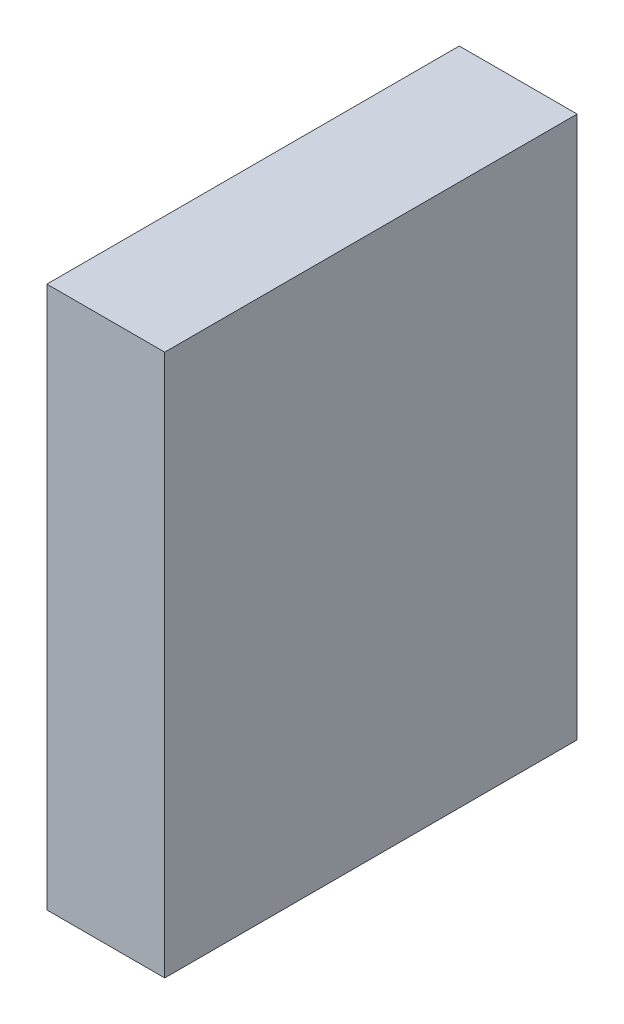
ISO-10303-21;
HEADER;
FILE_DESCRIPTION(('STEP AP214'),'2;1');
FILE_NAME('part.step','',(''),(''),'','','');
FILE_SCHEMA(('AUTOMOTIVE_DESIGN { 1 0 10303 214 1 1 1 1 }'));
ENDSEC;
DATA;
#1=APPLICATION_CONTEXT('core data for automotive mechanical design processes');
#2=APPLICATION_PROTOCOL_DEFINITION('international standard','automotive_design',2000,#1);
#3=PRODUCT_CONTEXT('',#1,'mechanical');
#4=PRODUCT('Part','Part','',(#3));
#5=PRODUCT_RELATED_PRODUCT_CATEGORY('part','',(#4));
#6=PRODUCT_DEFINITION_FORMATION('','',#4);
#7=PRODUCT_DEFINITION_CONTEXT('part definition',#1,'design');
#8=PRODUCT_DEFINITION('design','',#6,#7);
#9=PRODUCT_DEFINITION_SHAPE('','',#8);
#10=(LENGTH_UNIT() NAMED_UNIT(*) SI_UNIT(.MILLI.,.METRE.));
#11=(NAMED_UNIT(*) PLANE_ANGLE_UNIT() SI_UNIT($,.RADIAN.));
#12=(NAMED_UNIT(*) SI_UNIT($,.STERADIAN.) SOLID_ANGLE_UNIT());
#13=UNCERTAINTY_MEASURE_WITH_UNIT(LENGTH_MEASURE(1.E-05),#10,'distance_accuracy_value','');
#14=(GEOMETRIC_REPRESENTATION_CONTEXT(3) GLOBAL_UNCERTAINTY_ASSIGNED_CONTEXT((#13)) GLOBAL_UNIT_ASSIGNED_CONTEXT((#10,
#11,#12)) REPRESENTATION_CONTEXT('',''));
#15=CARTESIAN_POINT('',(0.,0.,0.));
#16=DIRECTION('',(0.,0.,1.));
#17=DIRECTION('',(1.,0.,0.));
#18=AXIS2_PLACEMENT_3D('',#15,#16,#17);
#19=CARTESIAN_POINT('',(10.,-23.,17.5));
#20=DIRECTION('',(0.,0.,-1.));
#21=DIRECTION('',(-1.,0.,0.));
#22=AXIS2_PLACEMENT_3D('',#19,#20,#21);
#23=PLANE('',#22);
#24=DIRECTION('',(0.,-1.,0.));
#25=VECTOR('',#24,1.);
#26=CARTESIAN_POINT('',(0.,-23.,17.5));
#27=LINE('',#26,#25);
#28=CARTESIAN_POINT('',(0.,23.,17.5));
#29=VERTEX_POINT('',#28);
#30=CARTESIAN_POINT('',(0.,-23.,17.5));
#31=VERTEX_POINT('',#30);
#32=EDGE_CURVE('E97',#29,#31,#27,.T.);
#33=ORIENTED_EDGE('',*,*,#32,.T.);
#34=DIRECTION('',(-1.,0.,0.));
#35=VECTOR('',#34,1.);
#36=CARTESIAN_POINT('',(10.,-23.,17.5));
#37=LINE('',#36,#35);
#38=CARTESIAN_POINT('',(10.,-23.,17.5));
#39=VERTEX_POINT('',#38);
#40=EDGE_CURVE('E11',#39,#31,#37,.T.);
#41=ORIENTED_EDGE('',*,*,#40,.F.);
#42=DIRECTION('',(0.,-1.,0.));
#43=VECTOR('',#42,1.);
#44=CARTESIAN_POINT('',(10.,-23.,17.5));
#45=LINE('',#44,#43);
#46=CARTESIAN_POINT('',(10.,23.,17.5));
#47=VERTEX_POINT('',#46);
#48=EDGE_CURVE('E85',#47,#39,#45,.T.);
#49=ORIENTED_EDGE('',*,*,#48,.F.);
#50=DIRECTION('',(-1.,0.,0.));
#51=VECTOR('',#50,1.);
#52=CARTESIAN_POINT('',(10.,23.,17.5));
#53=LINE('',#52,#51);
#54=EDGE_CURVE('E93',#47,#29,#53,.T.);
#55=ORIENTED_EDGE('',*,*,#54,.T.);
#56=EDGE_LOOP('',(#33,#41,#49,#55));
#57=FACE_BOUND('',#56,.T.);
#58=ADVANCED_FACE('F34',(#57),#23,.F.);
#59=CARTESIAN_POINT('',(10.,-23.,-17.5));
#60=DIRECTION('',(0.,1.,0.));
#61=DIRECTION('',(0.,0.,1.));
#62=AXIS2_PLACEMENT_3D('',#59,#60,#61);
#63=PLANE('',#62);
#64=DIRECTION('',(0.,0.,-1.));
#65=VECTOR('',#64,1.);
#66=CARTESIAN_POINT('',(0.,-23.,-17.5));
#67=LINE('',#66,#65);
#68=CARTESIAN_POINT('',(0.,-23.,-17.5));
#69=VERTEX_POINT('',#68);
#70=EDGE_CURVE('E89',#31,#69,#67,.T.);
#71=ORIENTED_EDGE('',*,*,#70,.T.);
#72=DIRECTION('',(-1.,0.,0.));
#73=VECTOR('',#72,1.);
#74=CARTESIAN_POINT('',(10.,-23.,-17.5));
#75=LINE('',#74,#73);
#76=CARTESIAN_POINT('',(10.,-23.,-17.5));
#77=VERTEX_POINT('',#76);
#78=EDGE_CURVE('E42',#77,#69,#75,.T.);
#79=ORIENTED_EDGE('',*,*,#78,.F.);
#80=DIRECTION('',(0.,0.,-1.));
#81=VECTOR('',#80,1.);
#82=CARTESIAN_POINT('',(10.,-23.,-17.5));
#83=LINE('',#82,#81);
#84=EDGE_CURVE('E80',#39,#77,#83,.T.);
#85=ORIENTED_EDGE('',*,*,#84,.F.);
#86=ORIENTED_EDGE('',*,*,#40,.T.);
#87=EDGE_LOOP('',(#71,#79,#85,#86));
#88=FACE_BOUND('',#87,.T.);
#89=ADVANCED_FACE('F88',(#88),#63,.F.);
#90=CARTESIAN_POINT('',(10.,-23.,-17.5));
#91=DIRECTION('',(0.,0.,1.));
#92=DIRECTION('',(1.,0.,0.));
#93=AXIS2_PLACEMENT_3D('',#90,#91,#92);
#94=PLANE('',#93);
#95=DIRECTION('',(0.,1.,0.));
#96=VECTOR('',#95,1.);
#97=CARTESIAN_POINT('',(0.,-23.,-17.5));
#98=LINE('',#97,#96);
#99=CARTESIAN_POINT('',(0.,23.,-17.5));
#100=VERTEX_POINT('',#99);
#101=EDGE_CURVE('E67',#69,#100,#98,.T.);
#102=ORIENTED_EDGE('',*,*,#101,.T.);
#103=DIRECTION('',(-1.,0.,0.));
#104=VECTOR('',#103,1.);
#105=CARTESIAN_POINT('',(10.,23.,-17.5));
#106=LINE('',#105,#104);
#107=CARTESIAN_POINT('',(10.,23.,-17.5));
#108=VERTEX_POINT('',#107);
#109=EDGE_CURVE('E90',#108,#100,#106,.T.);
#110=ORIENTED_EDGE('',*,*,#109,.F.);
#111=DIRECTION('',(0.,1.,0.));
#112=VECTOR('',#111,1.);
#113=CARTESIAN_POINT('',(10.,-23.,-17.5));
#114=LINE('',#113,#112);
#115=EDGE_CURVE('E83',#77,#108,#114,.T.);
#116=ORIENTED_EDGE('',*,*,#115,.F.);
#117=ORIENTED_EDGE('',*,*,#78,.T.);
#118=EDGE_LOOP('',(#102,#110,#116,#117));
#119=FACE_BOUND('',#118,.T.);
#120=ADVANCED_FACE('F91',(#119),#94,.F.);
#121=CARTESIAN_POINT('',(10.,23.,-17.5));
#122=DIRECTION('',(0.,-1.,0.));
#123=DIRECTION('',(0.,0.,-1.));
#124=AXIS2_PLACEMENT_3D('',#121,#122,#123);
#125=PLANE('',#124);
#126=DIRECTION('',(0.,0.,1.));
#127=VECTOR('',#126,1.);
#128=CARTESIAN_POINT('',(0.,23.,-17.5));
#129=LINE('',#128,#127);
#130=EDGE_CURVE('E73',#100,#29,#129,.T.);
#131=ORIENTED_EDGE('',*,*,#130,.T.);
#132=ORIENTED_EDGE('',*,*,#54,.F.);
#133=DIRECTION('',(0.,0.,1.));
#134=VECTOR('',#133,1.);
#135=CARTESIAN_POINT('',(10.,23.,-17.5));
#136=LINE('',#135,#134);
#137=EDGE_CURVE('E50',#108,#47,#136,.T.);
#138=ORIENTED_EDGE('',*,*,#137,.F.);
#139=ORIENTED_EDGE('',*,*,#109,.T.);
#140=EDGE_LOOP('',(#131,#132,#138,#139));
#141=FACE_BOUND('',#140,.T.);
#142=ADVANCED_FACE('F104',(#141),#125,.F.);
#143=CARTESIAN_POINT('',(10.,0.,0.));
#144=DIRECTION('',(1.,0.,0.));
#145=DIRECTION('',(0.,0.,-1.));
#146=AXIS2_PLACEMENT_3D('',#143,#144,#145);
#147=PLANE('',#146);
#148=ORIENTED_EDGE('',*,*,#48,.T.);
#149=ORIENTED_EDGE('',*,*,#84,.T.);
#150=ORIENTED_EDGE('',*,*,#115,.T.);
#151=ORIENTED_EDGE('',*,*,#137,.T.);
#152=EDGE_LOOP('',(#148,#149,#150,#151));
#153=FACE_BOUND('',#152,.T.);
#154=ADVANCED_FACE('F81',(#153),#147,.T.);
#155=CARTESIAN_POINT('',(0.,0.,0.));
#156=DIRECTION('',(1.,0.,0.));
#157=DIRECTION('',(0.,0.,-1.));
#158=AXIS2_PLACEMENT_3D('',#155,#156,#157);
#159=PLANE('',#158);
#160=ORIENTED_EDGE('',*,*,#32,.F.);
#161=ORIENTED_EDGE('',*,*,#130,.F.);
#162=ORIENTED_EDGE('',*,*,#101,.F.);
#163=ORIENTED_EDGE('',*,*,#70,.F.);
#164=EDGE_LOOP('',(#160,#161,#162,#163));
#165=FACE_BOUND('',#164,.T.);
#166=ADVANCED_FACE('F107',(#165),#159,.F.);
#167=CLOSED_SHELL('',(#58,#89,#120,#142,#154,#166));
#168=MANIFOLD_SOLID_BREP('B2',#167);
#169=ADVANCED_BREP_SHAPE_REPRESENTATION('',(#18,#168),#14);
#170=SHAPE_DEFINITION_REPRESENTATION(#9,#169);
ENDSEC;
END-ISO-10303-21;
